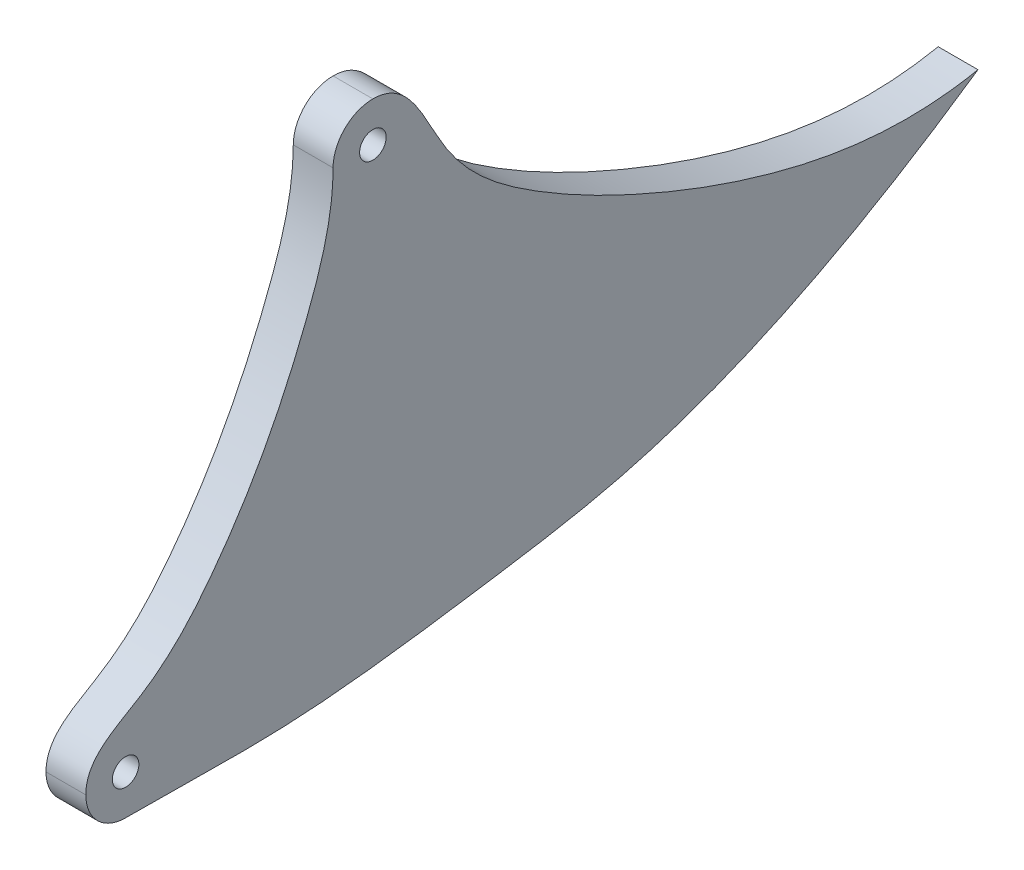
ISO-10303-21;
HEADER;
FILE_DESCRIPTION(('STEP AP214'),'2;1');
FILE_NAME('part.step','',(''),(''),'','','');
FILE_SCHEMA(('AUTOMOTIVE_DESIGN { 1 0 10303 214 1 1 1 1 }'));
ENDSEC;
DATA;
#1=APPLICATION_CONTEXT('core data for automotive mechanical design processes');
#2=APPLICATION_PROTOCOL_DEFINITION('international standard','automotive_design',2000,#1);
#3=PRODUCT_CONTEXT('',#1,'mechanical');
#4=PRODUCT('Part','Part','',(#3));
#5=PRODUCT_RELATED_PRODUCT_CATEGORY('part','',(#4));
#6=PRODUCT_DEFINITION_FORMATION('','',#4);
#7=PRODUCT_DEFINITION_CONTEXT('part definition',#1,'design');
#8=PRODUCT_DEFINITION('design','',#6,#7);
#9=PRODUCT_DEFINITION_SHAPE('','',#8);
#10=(LENGTH_UNIT() NAMED_UNIT(*) SI_UNIT(.MILLI.,.METRE.));
#11=(NAMED_UNIT(*) PLANE_ANGLE_UNIT() SI_UNIT($,.RADIAN.));
#12=(NAMED_UNIT(*) SI_UNIT($,.STERADIAN.) SOLID_ANGLE_UNIT());
#13=UNCERTAINTY_MEASURE_WITH_UNIT(LENGTH_MEASURE(1.E-05),#10,'distance_accuracy_value','');
#14=(GEOMETRIC_REPRESENTATION_CONTEXT(3) GLOBAL_UNCERTAINTY_ASSIGNED_CONTEXT((#13)) GLOBAL_UNIT_ASSIGNED_CONTEXT((#10,
#11,#12)) REPRESENTATION_CONTEXT('',''));
#15=CARTESIAN_POINT('',(0.,0.,0.));
#16=DIRECTION('',(0.,0.,1.));
#17=DIRECTION('',(1.,0.,0.));
#18=AXIS2_PLACEMENT_3D('',#15,#16,#17);
#19=CARTESIAN_POINT('',(4.5,-64.2810724963082,-53.5925917007982));
#20=DIRECTION('',(1.,0.,0.));
#21=DIRECTION('',(0.,0.,-1.));
#22=AXIS2_PLACEMENT_3D('',#19,#20,#21);
#23=PLANE('',#22);
#24=CARTESIAN_POINT('',(4.5,40.0799914534758,95.011279074395));
#25=DIRECTION('',(1.,0.,0.));
#26=DIRECTION('',(0.,0.,-1.));
#27=AXIS2_PLACEMENT_3D('',#24,#25,#26);
#28=CIRCLE('',#27,2.);
#29=CARTESIAN_POINT('',(4.5,40.0799914534758,93.011279074395));
#30=VERTEX_POINT('',#29);
#31=EDGE_CURVE('E60',#30,#30,#28,.T.);
#32=ORIENTED_EDGE('',*,*,#31,.F.);
#33=EDGE_LOOP('',(#32));
#34=FACE_BOUND('',#33,.T.);
#35=CARTESIAN_POINT('',(4.5,103.308446529786,57.7322974807005));
#36=DIRECTION('',(1.,0.,0.));
#37=DIRECTION('',(0.,0.,-1.));
#38=AXIS2_PLACEMENT_3D('',#35,#36,#37);
#39=CIRCLE('',#38,2.);
#40=CARTESIAN_POINT('',(4.5,103.308446529786,55.7322974807005));
#41=VERTEX_POINT('',#40);
#42=EDGE_CURVE('E11',#41,#41,#39,.T.);
#43=ORIENTED_EDGE('',*,*,#42,.F.);
#44=EDGE_LOOP('',(#43));
#45=FACE_BOUND('',#44,.T.);
#46=CARTESIAN_POINT('',(4.500012,67.5075496090713,-33.4943202340452));
#47=CARTESIAN_POINT('',(4.500012,56.4465242999661,-17.3735269540475));
#48=CARTESIAN_POINT('',(4.500012,42.766838929847,7.07685159229639));
#49=CARTESIAN_POINT('',(4.500012,37.0385929282088,43.4560509620804));
#50=CARTESIAN_POINT('',(4.500012,33.3114424770574,69.4295404719653));
#51=CARTESIAN_POINT('',(4.500012,34.0799914534758,85.7264416661606));
#52=CARTESIAN_POINT('',(4.500012,34.0799914534758,95.011279074395));
#53=B_SPLINE_CURVE_WITH_KNOTS('',3,(#46,#47,#48,#49,#50,#51,#52),.UNSPECIFIED.,.F.,.F.,(4,1,1,1,
4),(0.,0.437391753518815,0.598474456810003,0.819987557594354,1.),.UNSPECIFIED.);
#54=CARTESIAN_POINT('',(4.500006,34.0799914534758,95.011279074395));
#55=VERTEX_POINT('',#54);
#56=CARTESIAN_POINT('',(4.500006,67.5075496090714,-33.4943202340452));
#57=VERTEX_POINT('',#56);
#58=EDGE_CURVE('E102',#55,#57,#53,.F.);
#59=ORIENTED_EDGE('',*,*,#58,.T.);
#60=CARTESIAN_POINT('',(4.500012,109.308446529786,57.7322974807005));
#61=CARTESIAN_POINT('',(4.500012,109.308446529786,52.2110649663076));
#62=CARTESIAN_POINT('',(4.500012,95.4437292367337,47.5937884860702));
#63=CARTESIAN_POINT('',(4.500012,84.6131759854265,33.7201498700058));
#64=CARTESIAN_POINT('',(4.500012,76.1466573593553,16.9968115028458));
#65=CARTESIAN_POINT('',(4.500012,67.8453017174097,-5.2914459515167));
#66=CARTESIAN_POINT('',(4.500012,65.2093337822944,-22.1245338636738));
#67=CARTESIAN_POINT('',(4.500012,67.5075496090713,-33.4943202340452));
#68=B_SPLINE_CURVE_WITH_KNOTS('',3,(#60,#61,#62,#63,#64,#65,#66,#67),.UNSPECIFIED.,.F.,.F.,(4,1,
1,1,1,4),(0.,0.149514076436936,0.31812668523386,0.520375114918597,0.677352248387144,1.),.UNSPECIFIED.);
#69=CARTESIAN_POINT('',(4.500006,109.308446529786,57.7322974807005));
#70=VERTEX_POINT('',#69);
#71=EDGE_CURVE('E113',#57,#70,#68,.F.);
#72=ORIENTED_EDGE('',*,*,#71,.T.);
#73=CARTESIAN_POINT('',(4.5,109.308446529786,57.7322974807005));
#74=CARTESIAN_POINT('',(4.5,109.308446529786,58.9254987412331));
#75=CARTESIAN_POINT('',(4.5,108.851723724854,60.028398074891));
#76=CARTESIAN_POINT('',(4.5,108.395298269561,61.130579365316));
#77=CARTESIAN_POINT('',(4.5,107.551087216905,61.9749381678198));
#78=CARTESIAN_POINT('',(4.5,106.70761856137,62.8185544432719));
#79=CARTESIAN_POINT('',(4.5,105.604547123977,63.2755746757682));
#80=CARTESIAN_POINT('',(4.5,104.50219356257,63.7322974807005));
#81=CARTESIAN_POINT('',(4.5,103.308446529786,63.7322974807005));
#82=B_SPLINE_CURVE_WITH_KNOTS('',2,(#73,#74,#75,#76,#77,#78,#79,#80,#81),.UNSPECIFIED.,.F.,.F.,
(3,2,2,2,3),(0.,0.25,0.5,0.75,1.),.UNSPECIFIED.);
#83=CARTESIAN_POINT('',(4.500006,103.308446529786,63.7322974807005));
#84=VERTEX_POINT('',#83);
#85=EDGE_CURVE('E164',#70,#84,#82,.T.);
#86=ORIENTED_EDGE('',*,*,#85,.T.);
#87=CARTESIAN_POINT('',(4.500012,40.0799914534758,101.011279074395));
#88=CARTESIAN_POINT('',(4.500012,44.7181107256453,101.011279074395));
#89=CARTESIAN_POINT('',(4.500012,48.7372354567547,91.0729043125197));
#90=CARTESIAN_POINT('',(4.500012,58.7573945868865,81.9714958841757));
#91=CARTESIAN_POINT('',(4.500012,71.583405868989,73.7503356410433));
#92=CARTESIAN_POINT('',(4.500012,86.5125565732404,67.0513963181802));
#93=CARTESIAN_POINT('',(4.500012,96.9079894688286,63.7322974807005));
#94=CARTESIAN_POINT('',(4.500012,103.308446529786,63.7322974807005));
#95=B_SPLINE_CURVE_WITH_KNOTS('',3,(#87,#88,#89,#90,#91,#92,#93,#94),.UNSPECIFIED.,.F.,.F.,(4,1,
1,1,1,4),(0.,0.159897040100706,0.349721009668996,0.557731015747372,0.759617272715804,1.),.UNSPECIFIED.);
#96=CARTESIAN_POINT('',(4.500006,40.0799914534758,101.011279074395));
#97=VERTEX_POINT('',#96);
#98=EDGE_CURVE('E64',#84,#97,#95,.F.);
#99=ORIENTED_EDGE('',*,*,#98,.T.);
#100=CARTESIAN_POINT('',(4.5,40.0799914534758,101.011279074395));
#101=CARTESIAN_POINT('',(4.5,38.8867901929432,101.011279074395));
#102=CARTESIAN_POINT('',(4.5,37.7838908592853,100.554556269463));
#103=CARTESIAN_POINT('',(4.5,36.6817095688872,100.098130814181));
#104=CARTESIAN_POINT('',(4.5,35.8373507663565,99.2539197615143));
#105=CARTESIAN_POINT('',(4.5,34.9937344908886,98.4104511059793));
#106=CARTESIAN_POINT('',(4.5,34.5367142584081,97.3073796685856));
#107=CARTESIAN_POINT('',(4.5,34.0799914534758,96.2050261071411));
#108=CARTESIAN_POINT('',(4.5,34.0799914534758,95.011279074395));
#109=B_SPLINE_CURVE_WITH_KNOTS('',2,(#100,#101,#102,#103,#104,#105,#106,#107,#108),
.UNSPECIFIED.,.F.,.F.,(3,2,2,2,3),(0.,0.25,0.5,0.75,1.),.UNSPECIFIED.);
#110=EDGE_CURVE('E127',#97,#55,#109,.T.);
#111=ORIENTED_EDGE('',*,*,#110,.T.);
#112=EDGE_LOOP('',(#59,#72,#86,#99,#111));
#113=FACE_BOUND('',#112,.T.);
#114=ADVANCED_FACE('F46',(#34,#45,#113),#23,.T.);
#115=CARTESIAN_POINT('',(-1.5,-64.2810724963082,-53.5925917007982));
#116=DIRECTION('',(1.,0.,0.));
#117=DIRECTION('',(0.,0.,-1.));
#118=AXIS2_PLACEMENT_3D('',#115,#116,#117);
#119=PLANE('',#118);
#120=CARTESIAN_POINT('',(-1.5,103.308446529786,57.7322974807005));
#121=DIRECTION('',(1.,0.,0.));
#122=DIRECTION('',(0.,0.,-1.));
#123=AXIS2_PLACEMENT_3D('',#120,#121,#122);
#124=CIRCLE('',#123,2.);
#125=CARTESIAN_POINT('',(-1.5,103.308446529786,55.7322974807005));
#126=VERTEX_POINT('',#125);
#127=EDGE_CURVE('E306',#126,#126,#124,.T.);
#128=ORIENTED_EDGE('',*,*,#127,.T.);
#129=EDGE_LOOP('',(#128));
#130=FACE_BOUND('',#129,.T.);
#131=CARTESIAN_POINT('',(-1.5,40.0799914534758,95.011279074395));
#132=DIRECTION('',(1.,0.,0.));
#133=DIRECTION('',(0.,0.,-1.));
#134=AXIS2_PLACEMENT_3D('',#131,#132,#133);
#135=CIRCLE('',#134,2.);
#136=CARTESIAN_POINT('',(-1.5,40.0799914534758,93.011279074395));
#137=VERTEX_POINT('',#136);
#138=EDGE_CURVE('E310',#137,#137,#135,.T.);
#139=ORIENTED_EDGE('',*,*,#138,.T.);
#140=EDGE_LOOP('',(#139));
#141=FACE_BOUND('',#140,.T.);
#142=CARTESIAN_POINT('',(-1.5,67.5075496090713,-33.4943202340452));
#143=CARTESIAN_POINT('',(-1.5,65.2093337822944,-22.1245338636738));
#144=CARTESIAN_POINT('',(-1.5,67.8453017174097,-5.2914459515167));
#145=CARTESIAN_POINT('',(-1.5,76.1466573593553,16.9968115028458));
#146=CARTESIAN_POINT('',(-1.5,84.6131759854265,33.7201498700058));
#147=CARTESIAN_POINT('',(-1.5,95.4437292367337,47.5937884860702));
#148=CARTESIAN_POINT('',(-1.5,109.308446529786,52.2110649663076));
#149=CARTESIAN_POINT('',(-1.5,109.308446529786,57.7322974807005));
#150=B_SPLINE_CURVE_WITH_KNOTS('',3,(#142,#143,#144,#145,#146,#147,#148,#149),.UNSPECIFIED.,.F.,
.F.,(4,1,1,1,1,4),(0.,0.322647751612856,0.479624885081403,0.68187331476614,0.850485923563064,
1.),.UNSPECIFIED.);
#151=CARTESIAN_POINT('',(-1.5,67.5075496090714,-33.4943202340452));
#152=VERTEX_POINT('',#151);
#153=CARTESIAN_POINT('',(-1.5,109.308446529786,57.7322974807005));
#154=VERTEX_POINT('',#153);
#155=EDGE_CURVE('E167',#152,#154,#150,.T.);
#156=ORIENTED_EDGE('',*,*,#155,.F.);
#157=CARTESIAN_POINT('',(-1.5,34.0799914534758,95.011279074395));
#158=CARTESIAN_POINT('',(-1.5,34.0799914534758,85.7264416661606));
#159=CARTESIAN_POINT('',(-1.5,33.3114424770574,69.4295404719653));
#160=CARTESIAN_POINT('',(-1.5,37.0385929282088,43.4560509620804));
#161=CARTESIAN_POINT('',(-1.5,42.766838929847,7.07685159229639));
#162=CARTESIAN_POINT('',(-1.5,56.4465242999661,-17.3735269540475));
#163=CARTESIAN_POINT('',(-1.5,67.5075496090713,-33.4943202340452));
#164=B_SPLINE_CURVE_WITH_KNOTS('',3,(#157,#158,#159,#160,#161,#162,#163),.UNSPECIFIED.,.F.,.F.,
(4,1,1,1,4),(0.,0.180012442405646,0.401525543189997,0.562608246481185,1.),.UNSPECIFIED.);
#165=CARTESIAN_POINT('',(-1.5,34.0799914534758,95.011279074395));
#166=VERTEX_POINT('',#165);
#167=EDGE_CURVE('E107',#166,#152,#164,.T.);
#168=ORIENTED_EDGE('',*,*,#167,.F.);
#169=CARTESIAN_POINT('',(-1.5,40.0799914534758,95.011279074395));
#170=DIRECTION('',(1.,0.,0.));
#171=DIRECTION('',(0.,0.,-1.));
#172=AXIS2_PLACEMENT_3D('',#169,#170,#171);
#173=CIRCLE('',#172,6.00000000000001);
#174=CARTESIAN_POINT('',(-1.5,40.0799914534758,101.011279074395));
#175=VERTEX_POINT('',#174);
#176=EDGE_CURVE('E170',#175,#166,#173,.T.);
#177=ORIENTED_EDGE('',*,*,#176,.F.);
#178=CARTESIAN_POINT('',(-1.5,103.308446529786,63.7322974807005));
#179=CARTESIAN_POINT('',(-1.5,96.9079894688286,63.7322974807005));
#180=CARTESIAN_POINT('',(-1.5,86.5125565732404,67.0513963181802));
#181=CARTESIAN_POINT('',(-1.5,71.583405868989,73.7503356410433));
#182=CARTESIAN_POINT('',(-1.5,58.7573945868865,81.9714958841757));
#183=CARTESIAN_POINT('',(-1.5,48.7372354567547,91.0729043125197));
#184=CARTESIAN_POINT('',(-1.5,44.7181107256453,101.011279074395));
#185=CARTESIAN_POINT('',(-1.5,40.0799914534758,101.011279074395));
#186=B_SPLINE_CURVE_WITH_KNOTS('',3,(#178,#179,#180,#181,#182,#183,#184,#185),.UNSPECIFIED.,.F.,
.F.,(4,1,1,1,1,4),(0.,0.240382727284196,0.442268984252628,0.650278990331004,0.840102959899294,
1.),.UNSPECIFIED.);
#187=CARTESIAN_POINT('',(-1.5,103.308446529786,63.7322974807005));
#188=VERTEX_POINT('',#187);
#189=EDGE_CURVE('E229',#188,#175,#186,.T.);
#190=ORIENTED_EDGE('',*,*,#189,.F.);
#191=CARTESIAN_POINT('',(-1.5,103.308446529786,57.7322974807005));
#192=DIRECTION('',(1.,0.,0.));
#193=DIRECTION('',(0.,0.,-1.));
#194=AXIS2_PLACEMENT_3D('',#191,#192,#193);
#195=CIRCLE('',#194,6.);
#196=EDGE_CURVE('E115',#154,#188,#195,.T.);
#197=ORIENTED_EDGE('',*,*,#196,.F.);
#198=EDGE_LOOP('',(#156,#168,#177,#190,#197));
#199=FACE_BOUND('',#198,.T.);
#200=ADVANCED_FACE('F141',(#130,#141,#199),#119,.F.);
#201=CARTESIAN_POINT('',(4.5,103.308446529786,57.7322974807005));
#202=DIRECTION('',(-1.,0.,0.));
#203=DIRECTION('',(0.,0.,1.));
#204=AXIS2_PLACEMENT_3D('',#201,#202,#203);
#205=CYLINDRICAL_SURFACE('',#204,2.);
#206=ORIENTED_EDGE('',*,*,#42,.T.);
#207=EDGE_LOOP('',(#206));
#208=FACE_BOUND('',#207,.T.);
#209=ORIENTED_EDGE('',*,*,#127,.F.);
#210=EDGE_LOOP('',(#209));
#211=FACE_BOUND('',#210,.T.);
#212=ADVANCED_FACE('F284',(#208,#211),#205,.F.);
#213=CARTESIAN_POINT('',(4.5,40.0799914534758,95.011279074395));
#214=DIRECTION('',(-1.,0.,0.));
#215=DIRECTION('',(0.,0.,1.));
#216=AXIS2_PLACEMENT_3D('',#213,#214,#215);
#217=CYLINDRICAL_SURFACE('',#216,2.);
#218=ORIENTED_EDGE('',*,*,#31,.T.);
#219=EDGE_LOOP('',(#218));
#220=FACE_BOUND('',#219,.T.);
#221=ORIENTED_EDGE('',*,*,#138,.F.);
#222=EDGE_LOOP('',(#221));
#223=FACE_BOUND('',#222,.T.);
#224=ADVANCED_FACE('F48',(#220,#223),#217,.F.);
#225=DIRECTION('',(1.,0.,0.));
#226=VECTOR('',#225,1.);
#227=SURFACE_OF_LINEAR_EXTRUSION('',#150,#226);
#228=DIRECTION('',(1.,0.,0.));
#229=VECTOR('',#228,1.);
#230=CARTESIAN_POINT('',(-1.5,67.5075496090714,-33.4943202340452));
#231=LINE('',#230,#229);
#232=EDGE_CURVE('E97',#152,#57,#231,.T.);
#233=ORIENTED_EDGE('',*,*,#232,.F.);
#234=ORIENTED_EDGE('',*,*,#155,.T.);
#235=DIRECTION('',(1.,0.,0.));
#236=VECTOR('',#235,1.);
#237=CARTESIAN_POINT('',(-1.5,109.308446529786,57.7322974807005));
#238=LINE('',#237,#236);
#239=EDGE_CURVE('E118',#154,#70,#238,.T.);
#240=ORIENTED_EDGE('',*,*,#239,.T.);
#241=ORIENTED_EDGE('',*,*,#71,.F.);
#242=EDGE_LOOP('',(#233,#234,#240,#241));
#243=FACE_BOUND('',#242,.T.);
#244=ADVANCED_FACE('F120',(#243),#227,.T.);
#245=CARTESIAN_POINT('',(-1.5,103.308446529786,57.7322974807005));
#246=DIRECTION('',(1.,0.,0.));
#247=DIRECTION('',(0.,0.,-1.));
#248=AXIS2_PLACEMENT_3D('',#245,#246,#247);
#249=CYLINDRICAL_SURFACE('',#248,6.);
#250=ORIENTED_EDGE('',*,*,#239,.F.);
#251=ORIENTED_EDGE('',*,*,#196,.T.);
#252=DIRECTION('',(1.,0.,0.));
#253=VECTOR('',#252,1.);
#254=CARTESIAN_POINT('',(-1.5,103.308446529786,63.7322974807005));
#255=LINE('',#254,#253);
#256=EDGE_CURVE('E215',#188,#84,#255,.T.);
#257=ORIENTED_EDGE('',*,*,#256,.T.);
#258=ORIENTED_EDGE('',*,*,#85,.F.);
#259=EDGE_LOOP('',(#250,#251,#257,#258));
#260=FACE_BOUND('',#259,.T.);
#261=ADVANCED_FACE('F227',(#260),#249,.T.);
#262=DIRECTION('',(1.,0.,0.));
#263=VECTOR('',#262,1.);
#264=SURFACE_OF_LINEAR_EXTRUSION('',#186,#263);
#265=ORIENTED_EDGE('',*,*,#256,.F.);
#266=ORIENTED_EDGE('',*,*,#189,.T.);
#267=DIRECTION('',(1.,0.,0.));
#268=VECTOR('',#267,1.);
#269=CARTESIAN_POINT('',(-1.5,40.0799914534758,101.011279074395));
#270=LINE('',#269,#268);
#271=EDGE_CURVE('E71',#175,#97,#270,.T.);
#272=ORIENTED_EDGE('',*,*,#271,.T.);
#273=ORIENTED_EDGE('',*,*,#98,.F.);
#274=EDGE_LOOP('',(#265,#266,#272,#273));
#275=FACE_BOUND('',#274,.T.);
#276=ADVANCED_FACE('F218',(#275),#264,.T.);
#277=CARTESIAN_POINT('',(-1.5,40.0799914534758,95.011279074395));
#278=DIRECTION('',(1.,0.,0.));
#279=DIRECTION('',(0.,0.,-1.));
#280=AXIS2_PLACEMENT_3D('',#277,#278,#279);
#281=CYLINDRICAL_SURFACE('',#280,6.00000000000001);
#282=ORIENTED_EDGE('',*,*,#271,.F.);
#283=ORIENTED_EDGE('',*,*,#176,.T.);
#284=DIRECTION('',(1.,0.,0.));
#285=VECTOR('',#284,1.);
#286=CARTESIAN_POINT('',(-1.5,34.0799914534758,95.011279074395));
#287=LINE('',#286,#285);
#288=EDGE_CURVE('E112',#166,#55,#287,.T.);
#289=ORIENTED_EDGE('',*,*,#288,.T.);
#290=ORIENTED_EDGE('',*,*,#110,.F.);
#291=EDGE_LOOP('',(#282,#283,#289,#290));
#292=FACE_BOUND('',#291,.T.);
#293=ADVANCED_FACE('F186',(#292),#281,.T.);
#294=DIRECTION('',(1.,0.,0.));
#295=VECTOR('',#294,1.);
#296=SURFACE_OF_LINEAR_EXTRUSION('',#164,#295);
#297=ORIENTED_EDGE('',*,*,#288,.F.);
#298=ORIENTED_EDGE('',*,*,#167,.T.);
#299=ORIENTED_EDGE('',*,*,#232,.T.);
#300=ORIENTED_EDGE('',*,*,#58,.F.);
#301=EDGE_LOOP('',(#297,#298,#299,#300));
#302=FACE_BOUND('',#301,.T.);
#303=ADVANCED_FACE('F105',(#302),#296,.T.);
#304=CLOSED_SHELL('',(#114,#200,#212,#224,#244,#261,#276,#293,#303));
#305=MANIFOLD_SOLID_BREP('B2',#304);
#306=ADVANCED_BREP_SHAPE_REPRESENTATION('',(#18,#305),#14);
#307=SHAPE_DEFINITION_REPRESENTATION(#9,#306);
ENDSEC;
END-ISO-10303-21;
